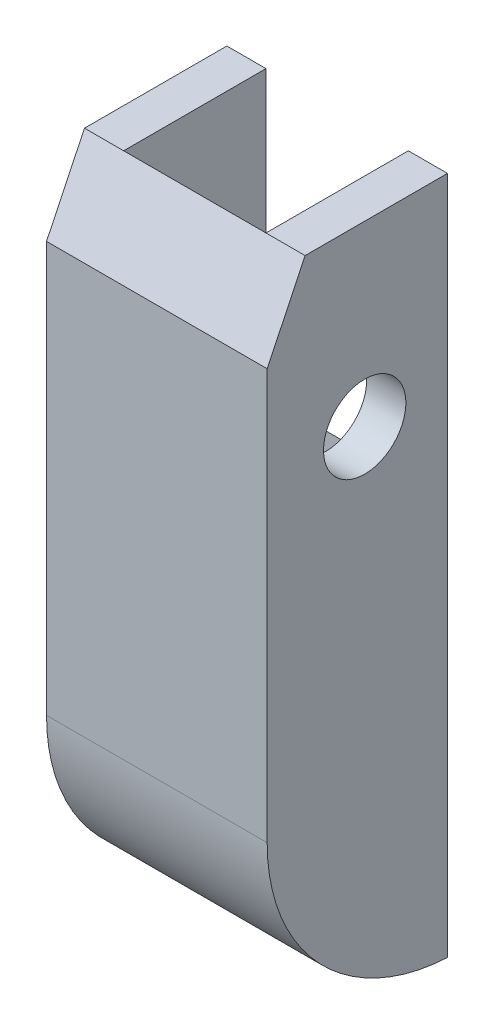
ISO-10303-21;
HEADER;
FILE_DESCRIPTION(('STEP AP214'),'2;1');
FILE_NAME('part.step','',(''),(''),'','','');
FILE_SCHEMA(('AUTOMOTIVE_DESIGN { 1 0 10303 214 1 1 1 1 }'));
ENDSEC;
DATA;
#1=APPLICATION_CONTEXT('core data for automotive mechanical design processes');
#2=APPLICATION_PROTOCOL_DEFINITION('international standard','automotive_design',2000,#1);
#3=PRODUCT_CONTEXT('',#1,'mechanical');
#4=PRODUCT('Part','Part','',(#3));
#5=PRODUCT_RELATED_PRODUCT_CATEGORY('part','',(#4));
#6=PRODUCT_DEFINITION_FORMATION('','',#4);
#7=PRODUCT_DEFINITION_CONTEXT('part definition',#1,'design');
#8=PRODUCT_DEFINITION('design','',#6,#7);
#9=PRODUCT_DEFINITION_SHAPE('','',#8);
#10=(LENGTH_UNIT() NAMED_UNIT(*) SI_UNIT(.MILLI.,.METRE.));
#11=(NAMED_UNIT(*) PLANE_ANGLE_UNIT() SI_UNIT($,.RADIAN.));
#12=(NAMED_UNIT(*) SI_UNIT($,.STERADIAN.) SOLID_ANGLE_UNIT());
#13=UNCERTAINTY_MEASURE_WITH_UNIT(LENGTH_MEASURE(1.E-05),#10,'distance_accuracy_value','');
#14=(GEOMETRIC_REPRESENTATION_CONTEXT(3) GLOBAL_UNCERTAINTY_ASSIGNED_CONTEXT((#13)) GLOBAL_UNIT_ASSIGNED_CONTEXT((#10,
#11,#12)) REPRESENTATION_CONTEXT('',''));
#15=CARTESIAN_POINT('',(0.,0.,0.));
#16=DIRECTION('',(0.,0.,1.));
#17=DIRECTION('',(1.,0.,0.));
#18=AXIS2_PLACEMENT_3D('',#15,#16,#17);
#19=CARTESIAN_POINT('',(0.,0.,7.62));
#20=DIRECTION('',(0.,0.,-1.));
#21=DIRECTION('',(-1.,0.,0.));
#22=AXIS2_PLACEMENT_3D('',#19,#20,#21);
#23=PLANE('',#22);
#24=DIRECTION('',(0.,-1.,0.));
#25=VECTOR('',#24,1.);
#26=CARTESIAN_POINT('',(9.7155,45.98924,7.62));
#27=LINE('',#26,#25);
#28=CARTESIAN_POINT('',(9.7155,36.34994,7.62));
#29=VERTEX_POINT('',#28);
#30=CARTESIAN_POINT('',(9.7155,26.82494,7.62));
#31=VERTEX_POINT('',#30);
#32=EDGE_CURVE('E188',#29,#31,#27,.T.);
#33=ORIENTED_EDGE('',*,*,#32,.T.);
#34=DIRECTION('',(1.,0.,0.));
#35=VECTOR('',#34,1.);
#36=CARTESIAN_POINT('',(-1.93222127853173,26.82494,7.62));
#37=LINE('',#36,#35);
#38=CARTESIAN_POINT('',(2.0955,26.82494,7.62));
#39=VERTEX_POINT('',#38);
#40=EDGE_CURVE('E141',#39,#31,#37,.T.);
#41=ORIENTED_EDGE('',*,*,#40,.F.);
#42=DIRECTION('',(0.,1.,0.));
#43=VECTOR('',#42,1.);
#44=CARTESIAN_POINT('',(2.0955,45.98924,7.62));
#45=LINE('',#44,#43);
#46=CARTESIAN_POINT('',(2.0955,36.34994,7.62));
#47=VERTEX_POINT('',#46);
#48=EDGE_CURVE('E146',#39,#47,#45,.T.);
#49=ORIENTED_EDGE('',*,*,#48,.T.);
#50=DIRECTION('',(-1.,0.,0.));
#51=VECTOR('',#50,1.);
#52=CARTESIAN_POINT('',(0.,36.34994,7.62));
#53=LINE('',#52,#51);
#54=EDGE_CURVE('E12',#29,#47,#53,.T.);
#55=ORIENTED_EDGE('',*,*,#54,.F.);
#56=EDGE_LOOP('',(#33,#41,#49,#55));
#57=FACE_BOUND('',#56,.T.);
#58=ADVANCED_FACE('F43',(#57),#23,.T.);
#59=CARTESIAN_POINT('',(11.811,0.,9.652));
#60=DIRECTION('',(-1.,0.,0.));
#61=DIRECTION('',(0.,0.,1.));
#62=AXIS2_PLACEMENT_3D('',#59,#60,#61);
#63=PLANE('',#62);
#64=CARTESIAN_POINT('',(11.811,26.82494,4.4323));
#65=DIRECTION('',(-1.,0.,0.));
#66=DIRECTION('',(0.,0.,1.));
#67=AXIS2_PLACEMENT_3D('',#64,#65,#66);
#68=CIRCLE('',#67,2.20345);
#69=CARTESIAN_POINT('',(11.811,26.82494,6.63575));
#70=VERTEX_POINT('',#69);
#71=EDGE_CURVE('E177',#70,#70,#68,.T.);
#72=ORIENTED_EDGE('',*,*,#71,.T.);
#73=EDGE_LOOP('',(#72));
#74=FACE_BOUND('',#73,.T.);
#75=DIRECTION('',(0.,1.,0.));
#76=VECTOR('',#75,1.);
#77=CARTESIAN_POINT('',(11.811,0.,0.));
#78=LINE('',#77,#76);
#79=CARTESIAN_POINT('',(11.811,0.,0.));
#80=VERTEX_POINT('',#79);
#81=CARTESIAN_POINT('',(11.811,36.34994,0.));
#82=VERTEX_POINT('',#81);
#83=EDGE_CURVE('E205',#80,#82,#78,.T.);
#84=ORIENTED_EDGE('',*,*,#83,.T.);
#85=DIRECTION('',(0.,0.,-1.));
#86=VECTOR('',#85,1.);
#87=CARTESIAN_POINT('',(11.811,36.34994,7.62));
#88=LINE('',#87,#86);
#89=CARTESIAN_POINT('',(11.811,36.34994,7.62));
#90=VERTEX_POINT('',#89);
#91=EDGE_CURVE('E158',#90,#82,#88,.T.);
#92=ORIENTED_EDGE('',*,*,#91,.F.);
#93=DIRECTION('',(0.,0.901435014436661,-0.432914442756968));
#94=VECTOR('',#93,1.);
#95=CARTESIAN_POINT('',(11.811,32.1188130880166,9.652));
#96=LINE('',#95,#94);
#97=CARTESIAN_POINT('',(11.811,32.1188130880166,9.652));
#98=VERTEX_POINT('',#97);
#99=EDGE_CURVE('E153',#98,#90,#96,.T.);
#100=ORIENTED_EDGE('',*,*,#99,.F.);
#101=DIRECTION('',(0.,1.,0.));
#102=VECTOR('',#101,1.);
#103=CARTESIAN_POINT('',(11.811,0.,9.652));
#104=LINE('',#103,#102);
#105=CARTESIAN_POINT('',(11.811,10.1472920525626,9.652));
#106=VERTEX_POINT('',#105);
#107=EDGE_CURVE('E196',#106,#98,#104,.T.);
#108=ORIENTED_EDGE('',*,*,#107,.F.);
#109=CARTESIAN_POINT('',(11.811,10.1472920525626,-0.508000000000002));
#110=DIRECTION('',(-1.,0.,0.));
#111=DIRECTION('',(0.,0.,1.));
#112=AXIS2_PLACEMENT_3D('',#109,#110,#111);
#113=CIRCLE('',#112,10.16);
#114=EDGE_CURVE('E214',#106,#80,#113,.F.);
#115=ORIENTED_EDGE('',*,*,#114,.T.);
#116=EDGE_LOOP('',(#84,#92,#100,#108,#115));
#117=FACE_BOUND('',#116,.T.);
#118=ADVANCED_FACE('F218',(#74,#117),#63,.F.);
#119=CARTESIAN_POINT('',(0.,0.,9.652));
#120=DIRECTION('',(-1.,0.,0.));
#121=DIRECTION('',(0.,0.,1.));
#122=AXIS2_PLACEMENT_3D('',#119,#120,#121);
#123=PLANE('',#122);
#124=DIRECTION('',(0.,0.,-1.));
#125=VECTOR('',#124,1.);
#126=CARTESIAN_POINT('',(0.,36.34994,7.62));
#127=LINE('',#126,#125);
#128=CARTESIAN_POINT('',(0.,36.34994,7.62));
#129=VERTEX_POINT('',#128);
#130=CARTESIAN_POINT('',(0.,36.34994,0.));
#131=VERTEX_POINT('',#130);
#132=EDGE_CURVE('E157',#129,#131,#127,.T.);
#133=ORIENTED_EDGE('',*,*,#132,.T.);
#134=DIRECTION('',(0.,1.,0.));
#135=VECTOR('',#134,1.);
#136=CARTESIAN_POINT('',(0.,0.,0.));
#137=LINE('',#136,#135);
#138=CARTESIAN_POINT('',(0.,0.,0.));
#139=VERTEX_POINT('',#138);
#140=EDGE_CURVE('E200',#139,#131,#137,.T.);
#141=ORIENTED_EDGE('',*,*,#140,.F.);
#142=CARTESIAN_POINT('',(0.,10.1472920525626,-0.508000000000002));
#143=DIRECTION('',(-1.,0.,0.));
#144=DIRECTION('',(0.,0.,1.));
#145=AXIS2_PLACEMENT_3D('',#142,#143,#144);
#146=CIRCLE('',#145,10.16);
#147=CARTESIAN_POINT('',(0.,10.1472920525626,9.652));
#148=VERTEX_POINT('',#147);
#149=EDGE_CURVE('E51',#139,#148,#146,.T.);
#150=ORIENTED_EDGE('',*,*,#149,.T.);
#151=DIRECTION('',(0.,1.,0.));
#152=VECTOR('',#151,1.);
#153=CARTESIAN_POINT('',(0.,0.,9.652));
#154=LINE('',#153,#152);
#155=CARTESIAN_POINT('',(0.,32.1188130880166,9.652));
#156=VERTEX_POINT('',#155);
#157=EDGE_CURVE('E199',#148,#156,#154,.T.);
#158=ORIENTED_EDGE('',*,*,#157,.T.);
#159=DIRECTION('',(0.,0.901435014436661,-0.432914442756968));
#160=VECTOR('',#159,1.);
#161=CARTESIAN_POINT('',(0.,32.1188130880166,9.652));
#162=LINE('',#161,#160);
#163=EDGE_CURVE('E154',#156,#129,#162,.T.);
#164=ORIENTED_EDGE('',*,*,#163,.T.);
#165=EDGE_LOOP('',(#133,#141,#150,#158,#164));
#166=FACE_BOUND('',#165,.T.);
#167=CARTESIAN_POINT('',(0.,26.82494,4.4323));
#168=DIRECTION('',(-1.,0.,0.));
#169=DIRECTION('',(0.,0.,1.));
#170=AXIS2_PLACEMENT_3D('',#167,#168,#169);
#171=CIRCLE('',#170,2.20345);
#172=CARTESIAN_POINT('',(0.,26.82494,6.63575));
#173=VERTEX_POINT('',#172);
#174=EDGE_CURVE('E184',#173,#173,#171,.T.);
#175=ORIENTED_EDGE('',*,*,#174,.F.);
#176=EDGE_LOOP('',(#175));
#177=FACE_BOUND('',#176,.T.);
#178=ADVANCED_FACE('F230',(#166,#177),#123,.T.);
#179=CARTESIAN_POINT('',(0.,0.,9.652));
#180=DIRECTION('',(0.,0.,1.));
#181=DIRECTION('',(1.,0.,0.));
#182=AXIS2_PLACEMENT_3D('',#179,#180,#181);
#183=PLANE('',#182);
#184=DIRECTION('',(1.,0.,0.));
#185=VECTOR('',#184,1.);
#186=CARTESIAN_POINT('',(0.,32.1188130880166,9.652));
#187=LINE('',#186,#185);
#188=EDGE_CURVE('E161',#156,#98,#187,.T.);
#189=ORIENTED_EDGE('',*,*,#188,.F.);
#190=ORIENTED_EDGE('',*,*,#157,.F.);
#191=DIRECTION('',(-1.,0.,0.));
#192=VECTOR('',#191,1.);
#193=CARTESIAN_POINT('',(11.811,10.1472920525626,9.652));
#194=LINE('',#193,#192);
#195=EDGE_CURVE('E202',#148,#106,#194,.F.);
#196=ORIENTED_EDGE('',*,*,#195,.T.);
#197=ORIENTED_EDGE('',*,*,#107,.T.);
#198=EDGE_LOOP('',(#189,#190,#196,#197));
#199=FACE_BOUND('',#198,.T.);
#200=ADVANCED_FACE('F229',(#199),#183,.T.);
#201=CARTESIAN_POINT('',(0.,0.,0.));
#202=DIRECTION('',(0.,0.,1.));
#203=DIRECTION('',(1.,0.,0.));
#204=AXIS2_PLACEMENT_3D('',#201,#202,#203);
#205=PLANE('',#204);
#206=DIRECTION('',(0.,1.,0.));
#207=VECTOR('',#206,1.);
#208=CARTESIAN_POINT('',(2.0955,45.98924,0.));
#209=LINE('',#208,#207);
#210=CARTESIAN_POINT('',(2.0955,21.1600760854083,0.));
#211=VERTEX_POINT('',#210);
#212=CARTESIAN_POINT('',(2.0955,36.34994,0.));
#213=VERTEX_POINT('',#212);
#214=EDGE_CURVE('E191',#211,#213,#209,.T.);
#215=ORIENTED_EDGE('',*,*,#214,.F.);
#216=DIRECTION('',(1.,0.,0.));
#217=VECTOR('',#216,1.);
#218=CARTESIAN_POINT('',(-3.6265634608912,21.1600760854083,0.));
#219=LINE('',#218,#217);
#220=CARTESIAN_POINT('',(9.7155,21.1600760854083,0.));
#221=VERTEX_POINT('',#220);
#222=EDGE_CURVE('E129',#211,#221,#219,.T.);
#223=ORIENTED_EDGE('',*,*,#222,.T.);
#224=DIRECTION('',(0.,-1.,0.));
#225=VECTOR('',#224,1.);
#226=CARTESIAN_POINT('',(9.7155,45.98924,0.));
#227=LINE('',#226,#225);
#228=CARTESIAN_POINT('',(9.7155,36.34994,0.));
#229=VERTEX_POINT('',#228);
#230=EDGE_CURVE('E187',#229,#221,#227,.T.);
#231=ORIENTED_EDGE('',*,*,#230,.F.);
#232=DIRECTION('',(1.,0.,0.));
#233=VECTOR('',#232,1.);
#234=CARTESIAN_POINT('',(0.,36.34994,0.));
#235=LINE('',#234,#233);
#236=EDGE_CURVE('E168',#229,#82,#235,.T.);
#237=ORIENTED_EDGE('',*,*,#236,.T.);
#238=ORIENTED_EDGE('',*,*,#83,.F.);
#239=DIRECTION('',(1.,0.,0.));
#240=VECTOR('',#239,1.);
#241=CARTESIAN_POINT('',(0.,0.,0.));
#242=LINE('',#241,#240);
#243=EDGE_CURVE('E193',#139,#80,#242,.T.);
#244=ORIENTED_EDGE('',*,*,#243,.F.);
#245=ORIENTED_EDGE('',*,*,#140,.T.);
#246=EDGE_CURVE('E164',#131,#213,#235,.T.);
#247=ORIENTED_EDGE('',*,*,#246,.T.);
#248=EDGE_LOOP('',(#215,#223,#231,#237,#238,#244,#245,#247));
#249=FACE_BOUND('',#248,.T.);
#250=ADVANCED_FACE('F225',(#249),#205,.F.);
#251=CARTESIAN_POINT('',(9.7155,45.98924,7.62));
#252=DIRECTION('',(1.,0.,0.));
#253=DIRECTION('',(0.,1.,0.));
#254=AXIS2_PLACEMENT_3D('',#251,#252,#253);
#255=PLANE('',#254);
#256=CARTESIAN_POINT('',(9.7155,26.82494,4.4323));
#257=DIRECTION('',(1.,0.,0.));
#258=DIRECTION('',(0.,1.,0.));
#259=AXIS2_PLACEMENT_3D('',#256,#257,#258);
#260=CIRCLE('',#259,2.20345);
#261=CARTESIAN_POINT('',(9.7155,29.02839,4.4323));
#262=VERTEX_POINT('',#261);
#263=EDGE_CURVE('E181',#262,#262,#260,.T.);
#264=ORIENTED_EDGE('',*,*,#263,.T.);
#265=EDGE_LOOP('',(#264));
#266=FACE_BOUND('',#265,.T.);
#267=DIRECTION('',(0.,-0.432914442756968,-0.901435014436661));
#268=VECTOR('',#267,1.);
#269=CARTESIAN_POINT('',(9.7155,17.1943622298093,-8.25759774589093));
#270=LINE('',#269,#268);
#271=CARTESIAN_POINT('',(9.7155,23.9514356044802,5.81230136917639));
#272=VERTEX_POINT('',#271);
#273=EDGE_CURVE('E133',#272,#221,#270,.T.);
#274=ORIENTED_EDGE('',*,*,#273,.F.);
#275=CARTESIAN_POINT('',(9.7155,26.82494,4.4323));
#276=DIRECTION('',(-1.,0.,0.));
#277=DIRECTION('',(0.,-1.,0.));
#278=AXIS2_PLACEMENT_3D('',#275,#276,#277);
#279=CIRCLE('',#278,3.1877);
#280=EDGE_CURVE('E140',#272,#31,#279,.T.);
#281=ORIENTED_EDGE('',*,*,#280,.T.);
#282=ORIENTED_EDGE('',*,*,#32,.F.);
#283=DIRECTION('',(0.,0.,-1.));
#284=VECTOR('',#283,1.);
#285=CARTESIAN_POINT('',(9.7155,36.34994,7.62));
#286=LINE('',#285,#284);
#287=EDGE_CURVE('E174',#29,#229,#286,.T.);
#288=ORIENTED_EDGE('',*,*,#287,.T.);
#289=ORIENTED_EDGE('',*,*,#230,.T.);
#290=EDGE_LOOP('',(#274,#281,#282,#288,#289));
#291=FACE_BOUND('',#290,.T.);
#292=ADVANCED_FACE('F238',(#266,#291),#255,.F.);
#293=CARTESIAN_POINT('',(2.0955,45.98924,7.62));
#294=DIRECTION('',(-1.,0.,0.));
#295=DIRECTION('',(0.,-1.,0.));
#296=AXIS2_PLACEMENT_3D('',#293,#294,#295);
#297=PLANE('',#296);
#298=CARTESIAN_POINT('',(2.0955,26.82494,4.4323));
#299=DIRECTION('',(-1.,0.,0.));
#300=DIRECTION('',(0.,-1.,0.));
#301=AXIS2_PLACEMENT_3D('',#298,#299,#300);
#302=CIRCLE('',#301,2.20345);
#303=CARTESIAN_POINT('',(2.0955,24.62149,4.4323));
#304=VERTEX_POINT('',#303);
#305=EDGE_CURVE('E180',#304,#304,#302,.T.);
#306=ORIENTED_EDGE('',*,*,#305,.T.);
#307=EDGE_LOOP('',(#306));
#308=FACE_BOUND('',#307,.T.);
#309=ORIENTED_EDGE('',*,*,#48,.F.);
#310=CARTESIAN_POINT('',(2.0955,26.82494,4.4323));
#311=DIRECTION('',(-1.,0.,0.));
#312=DIRECTION('',(0.,-1.,0.));
#313=AXIS2_PLACEMENT_3D('',#310,#311,#312);
#314=CIRCLE('',#313,3.1877);
#315=CARTESIAN_POINT('',(2.0955,23.9514356044802,5.81230136917639));
#316=VERTEX_POINT('',#315);
#317=EDGE_CURVE('E137',#316,#39,#314,.T.);
#318=ORIENTED_EDGE('',*,*,#317,.F.);
#319=DIRECTION('',(0.,-0.432914442756968,-0.901435014436662));
#320=VECTOR('',#319,1.);
#321=CARTESIAN_POINT('',(2.0955,17.1943622298093,-8.25759774589093));
#322=LINE('',#321,#320);
#323=EDGE_CURVE('E122',#316,#211,#322,.T.);
#324=ORIENTED_EDGE('',*,*,#323,.T.);
#325=ORIENTED_EDGE('',*,*,#214,.T.);
#326=DIRECTION('',(0.,0.,1.));
#327=VECTOR('',#326,1.);
#328=CARTESIAN_POINT('',(2.0955,36.34994,7.62));
#329=LINE('',#328,#327);
#330=EDGE_CURVE('E167',#213,#47,#329,.T.);
#331=ORIENTED_EDGE('',*,*,#330,.T.);
#332=EDGE_LOOP('',(#309,#318,#324,#325,#331));
#333=FACE_BOUND('',#332,.T.);
#334=ADVANCED_FACE('F144',(#308,#333),#297,.F.);
#335=CARTESIAN_POINT('',(11.811,26.82494,4.4323));
#336=DIRECTION('',(-1.,0.,0.));
#337=DIRECTION('',(0.,0.,1.));
#338=AXIS2_PLACEMENT_3D('',#335,#336,#337);
#339=CYLINDRICAL_SURFACE('',#338,2.20345);
#340=ORIENTED_EDGE('',*,*,#174,.T.);
#341=EDGE_LOOP('',(#340));
#342=FACE_BOUND('',#341,.T.);
#343=ORIENTED_EDGE('',*,*,#305,.F.);
#344=EDGE_LOOP('',(#343));
#345=FACE_BOUND('',#344,.T.);
#346=ADVANCED_FACE('F257',(#342,#345),#339,.F.);
#347=ORIENTED_EDGE('',*,*,#71,.F.);
#348=EDGE_LOOP('',(#347));
#349=FACE_BOUND('',#348,.T.);
#350=ORIENTED_EDGE('',*,*,#263,.F.);
#351=EDGE_LOOP('',(#350));
#352=FACE_BOUND('',#351,.T.);
#353=ADVANCED_FACE('F253',(#349,#352),#339,.F.);
#354=CARTESIAN_POINT('',(0.,10.1472920525626,-0.508000000000002));
#355=DIRECTION('',(1.,0.,0.));
#356=DIRECTION('',(0.,0.,-1.));
#357=AXIS2_PLACEMENT_3D('',#354,#355,#356);
#358=CYLINDRICAL_SURFACE('',#357,10.16);
#359=ORIENTED_EDGE('',*,*,#149,.F.);
#360=ORIENTED_EDGE('',*,*,#243,.T.);
#361=ORIENTED_EDGE('',*,*,#114,.F.);
#362=ORIENTED_EDGE('',*,*,#195,.F.);
#363=EDGE_LOOP('',(#359,#360,#361,#362));
#364=FACE_BOUND('',#363,.T.);
#365=ADVANCED_FACE('F45',(#364),#358,.T.);
#366=CARTESIAN_POINT('',(0.,36.34994,7.62));
#367=DIRECTION('',(0.,-1.,0.));
#368=DIRECTION('',(0.,0.,-1.));
#369=AXIS2_PLACEMENT_3D('',#366,#367,#368);
#370=PLANE('',#369);
#371=DIRECTION('',(1.,0.,0.));
#372=VECTOR('',#371,1.);
#373=CARTESIAN_POINT('',(0.,36.34994,7.62));
#374=LINE('',#373,#372);
#375=EDGE_CURVE('E57',#29,#90,#374,.T.);
#376=ORIENTED_EDGE('',*,*,#375,.T.);
#377=ORIENTED_EDGE('',*,*,#91,.T.);
#378=ORIENTED_EDGE('',*,*,#236,.F.);
#379=ORIENTED_EDGE('',*,*,#287,.F.);
#380=EDGE_LOOP('',(#376,#377,#378,#379));
#381=FACE_BOUND('',#380,.T.);
#382=ADVANCED_FACE('F241',(#381),#370,.F.);
#383=ORIENTED_EDGE('',*,*,#246,.F.);
#384=ORIENTED_EDGE('',*,*,#132,.F.);
#385=EDGE_CURVE('E169',#129,#47,#374,.T.);
#386=ORIENTED_EDGE('',*,*,#385,.T.);
#387=ORIENTED_EDGE('',*,*,#330,.F.);
#388=EDGE_LOOP('',(#383,#384,#386,#387));
#389=FACE_BOUND('',#388,.T.);
#390=ADVANCED_FACE('F236',(#389),#370,.F.);
#391=CARTESIAN_POINT('',(0.,32.1188130880166,9.652));
#392=DIRECTION('',(0.,-0.432914442756968,-0.901435014436661));
#393=DIRECTION('',(0.,0.901435014436661,-0.432914442756968));
#394=AXIS2_PLACEMENT_3D('',#391,#392,#393);
#395=PLANE('',#394);
#396=ORIENTED_EDGE('',*,*,#99,.T.);
#397=ORIENTED_EDGE('',*,*,#375,.F.);
#398=ORIENTED_EDGE('',*,*,#54,.T.);
#399=ORIENTED_EDGE('',*,*,#385,.F.);
#400=ORIENTED_EDGE('',*,*,#163,.F.);
#401=ORIENTED_EDGE('',*,*,#188,.T.);
#402=EDGE_LOOP('',(#396,#397,#398,#399,#400,#401));
#403=FACE_BOUND('',#402,.T.);
#404=ADVANCED_FACE('F233',(#403),#395,.F.);
#405=CARTESIAN_POINT('',(-3.6265634608912,17.1943622298093,-8.25759774589093));
#406=DIRECTION('',(0.,-0.901435014436661,0.432914442756968));
#407=DIRECTION('',(0.,-0.432914442756968,-0.901435014436661));
#408=AXIS2_PLACEMENT_3D('',#405,#406,#407);
#409=PLANE('',#408);
#410=ORIENTED_EDGE('',*,*,#323,.F.);
#411=DIRECTION('',(1.,0.,0.));
#412=VECTOR('',#411,1.);
#413=CARTESIAN_POINT('',(-1.93222127853173,23.9514356044802,5.81230136917639));
#414=LINE('',#413,#412);
#415=EDGE_CURVE('E126',#316,#272,#414,.T.);
#416=ORIENTED_EDGE('',*,*,#415,.T.);
#417=ORIENTED_EDGE('',*,*,#273,.T.);
#418=ORIENTED_EDGE('',*,*,#222,.F.);
#419=EDGE_LOOP('',(#410,#416,#417,#418));
#420=FACE_BOUND('',#419,.T.);
#421=ADVANCED_FACE('F124',(#420),#409,.F.);
#422=CARTESIAN_POINT('',(-1.93222127853173,26.82494,4.4323));
#423=DIRECTION('',(1.,0.,0.));
#424=DIRECTION('',(0.,1.,0.));
#425=AXIS2_PLACEMENT_3D('',#422,#423,#424);
#426=CYLINDRICAL_SURFACE('',#425,3.1877);
#427=ORIENTED_EDGE('',*,*,#415,.F.);
#428=ORIENTED_EDGE('',*,*,#317,.T.);
#429=ORIENTED_EDGE('',*,*,#40,.T.);
#430=ORIENTED_EDGE('',*,*,#280,.F.);
#431=EDGE_LOOP('',(#427,#428,#429,#430));
#432=FACE_BOUND('',#431,.T.);
#433=ADVANCED_FACE('F136',(#432),#426,.F.);
#434=CLOSED_SHELL('',(#58,#118,#178,#200,#250,#292,#334,#346,#353,#365,#382,#390,#404,#421,#433));
#435=MANIFOLD_SOLID_BREP('B2',#434);
#436=ADVANCED_BREP_SHAPE_REPRESENTATION('',(#18,#435),#14);
#437=SHAPE_DEFINITION_REPRESENTATION(#9,#436);
ENDSEC;
END-ISO-10303-21;
